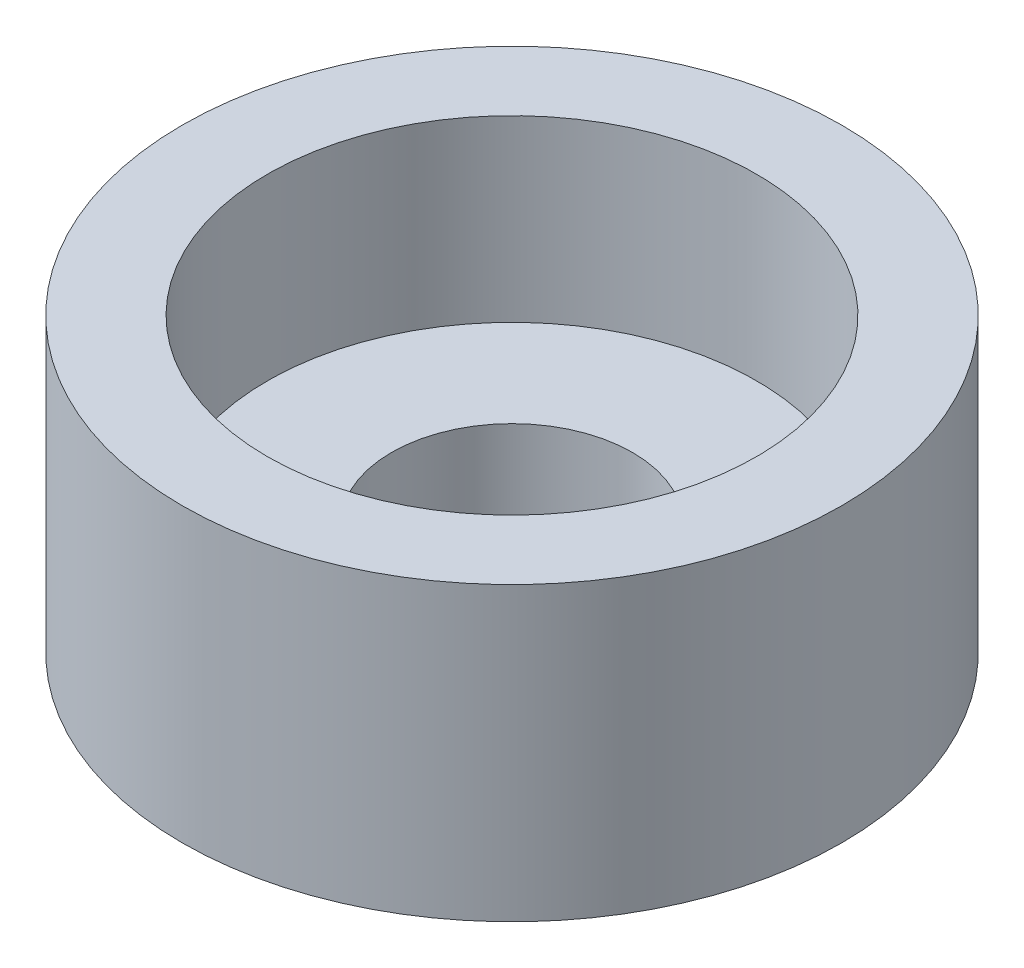
ISO-10303-21;
HEADER;
FILE_DESCRIPTION(('STEP AP214'),'2;1');
FILE_NAME('part.step','',(''),(''),'','','');
FILE_SCHEMA(('AUTOMOTIVE_DESIGN { 1 0 10303 214 1 1 1 1 }'));
ENDSEC;
DATA;
#1=APPLICATION_CONTEXT('core data for automotive mechanical design processes');
#2=APPLICATION_PROTOCOL_DEFINITION('international standard','automotive_design',2000,#1);
#3=PRODUCT_CONTEXT('',#1,'mechanical');
#4=PRODUCT('Part','Part','',(#3));
#5=PRODUCT_RELATED_PRODUCT_CATEGORY('part','',(#4));
#6=PRODUCT_DEFINITION_FORMATION('','',#4);
#7=PRODUCT_DEFINITION_CONTEXT('part definition',#1,'design');
#8=PRODUCT_DEFINITION('design','',#6,#7);
#9=PRODUCT_DEFINITION_SHAPE('','',#8);
#10=(LENGTH_UNIT() NAMED_UNIT(*) SI_UNIT(.MILLI.,.METRE.));
#11=(NAMED_UNIT(*) PLANE_ANGLE_UNIT() SI_UNIT($,.RADIAN.));
#12=(NAMED_UNIT(*) SI_UNIT($,.STERADIAN.) SOLID_ANGLE_UNIT());
#13=UNCERTAINTY_MEASURE_WITH_UNIT(LENGTH_MEASURE(1.E-05),#10,'distance_accuracy_value','');
#14=(GEOMETRIC_REPRESENTATION_CONTEXT(3) GLOBAL_UNCERTAINTY_ASSIGNED_CONTEXT((#13)) GLOBAL_UNIT_ASSIGNED_CONTEXT((#10,
#11,#12)) REPRESENTATION_CONTEXT('',''));
#15=CARTESIAN_POINT('',(0.,0.,0.));
#16=DIRECTION('',(0.,0.,1.));
#17=DIRECTION('',(1.,0.,0.));
#18=AXIS2_PLACEMENT_3D('',#15,#16,#17);
#19=CARTESIAN_POINT('',(0.,31.,0.));
#20=DIRECTION('',(0.,-1.,0.));
#21=DIRECTION('',(0.,0.,-1.));
#22=AXIS2_PLACEMENT_3D('',#19,#20,#21);
#23=CYLINDRICAL_SURFACE('',#22,12.8);
#24=CARTESIAN_POINT('',(0.,0.,0.));
#25=DIRECTION('',(0.,1.,0.));
#26=DIRECTION('',(0.,0.,1.));
#27=AXIS2_PLACEMENT_3D('',#24,#25,#26);
#28=CIRCLE('',#27,12.8);
#29=CARTESIAN_POINT('',(0.,0.,12.8));
#30=VERTEX_POINT('',#29);
#31=EDGE_CURVE('E58',#30,#30,#28,.T.);
#32=ORIENTED_EDGE('',*,*,#31,.F.);
#33=EDGE_LOOP('',(#32));
#34=FACE_BOUND('',#33,.T.);
#35=CARTESIAN_POINT('',(0.,12.,0.));
#36=DIRECTION('',(0.,1.,0.));
#37=DIRECTION('',(0.,0.,1.));
#38=AXIS2_PLACEMENT_3D('',#35,#36,#37);
#39=CIRCLE('',#38,12.8);
#40=CARTESIAN_POINT('',(0.,12.,12.8));
#41=VERTEX_POINT('',#40);
#42=EDGE_CURVE('E47',#41,#41,#39,.T.);
#43=ORIENTED_EDGE('',*,*,#42,.T.);
#44=EDGE_LOOP('',(#43));
#45=FACE_BOUND('',#44,.T.);
#46=ADVANCED_FACE('F43',(#34,#45),#23,.F.);
#47=CARTESIAN_POINT('',(0.,31.,0.));
#48=DIRECTION('',(0.,1.,0.));
#49=DIRECTION('',(0.,0.,1.));
#50=AXIS2_PLACEMENT_3D('',#47,#48,#49);
#51=PLANE('',#50);
#52=CARTESIAN_POINT('',(0.,31.,0.));
#53=DIRECTION('',(0.,1.,0.));
#54=DIRECTION('',(0.,0.,1.));
#55=AXIS2_PLACEMENT_3D('',#52,#53,#54);
#56=CIRCLE('',#55,25.97);
#57=CARTESIAN_POINT('',(0.,31.,25.97));
#58=VERTEX_POINT('',#57);
#59=EDGE_CURVE('E63',#58,#58,#56,.T.);
#60=ORIENTED_EDGE('',*,*,#59,.F.);
#61=EDGE_LOOP('',(#60));
#62=FACE_BOUND('',#61,.T.);
#63=CARTESIAN_POINT('',(0.,31.,0.));
#64=DIRECTION('',(0.,1.,0.));
#65=DIRECTION('',(0.,0.,1.));
#66=AXIS2_PLACEMENT_3D('',#63,#64,#65);
#67=CIRCLE('',#66,35.);
#68=CARTESIAN_POINT('',(0.,31.,35.));
#69=VERTEX_POINT('',#68);
#70=EDGE_CURVE('E10',#69,#69,#67,.T.);
#71=ORIENTED_EDGE('',*,*,#70,.T.);
#72=EDGE_LOOP('',(#71));
#73=FACE_BOUND('',#72,.T.);
#74=ADVANCED_FACE('F108',(#62,#73),#51,.T.);
#75=CARTESIAN_POINT('',(0.,0.,0.));
#76=DIRECTION('',(0.,1.,0.));
#77=DIRECTION('',(0.,0.,1.));
#78=AXIS2_PLACEMENT_3D('',#75,#76,#77);
#79=PLANE('',#78);
#80=CARTESIAN_POINT('',(-25.362762044836,0.,-1.37488234297628));
#81=DIRECTION('',(0.,-1.,0.));
#82=DIRECTION('',(0.,0.,-1.));
#83=AXIS2_PLACEMENT_3D('',#80,#81,#82);
#84=CIRCLE('',#83,2.125);
#85=CARTESIAN_POINT('',(-25.362762044836,0.,-3.49988234297629));
#86=VERTEX_POINT('',#85);
#87=EDGE_CURVE('E88',#86,#86,#84,.T.);
#88=ORIENTED_EDGE('',*,*,#87,.F.);
#89=EDGE_LOOP('',(#88));
#90=FACE_BOUND('',#89,.T.);
#91=CARTESIAN_POINT('',(11.4906979861859,0.,22.6522374124558));
#92=DIRECTION('',(0.,-1.,0.));
#93=DIRECTION('',(0.,0.,-1.));
#94=AXIS2_PLACEMENT_3D('',#91,#92,#93);
#95=CIRCLE('',#94,2.125);
#96=CARTESIAN_POINT('',(11.4906979861859,0.,20.5272374124558));
#97=VERTEX_POINT('',#96);
#98=EDGE_CURVE('E80',#97,#97,#95,.T.);
#99=ORIENTED_EDGE('',*,*,#98,.F.);
#100=EDGE_LOOP('',(#99));
#101=FACE_BOUND('',#100,.T.);
#102=CARTESIAN_POINT('',(13.87206405865,0.,-21.2773550694797));
#103=DIRECTION('',(0.,-1.,0.));
#104=DIRECTION('',(0.,0.,-1.));
#105=AXIS2_PLACEMENT_3D('',#102,#103,#104);
#106=CIRCLE('',#105,2.125);
#107=CARTESIAN_POINT('',(13.87206405865,0.,-23.4023550694797));
#108=VERTEX_POINT('',#107);
#109=EDGE_CURVE('E72',#108,#108,#106,.T.);
#110=ORIENTED_EDGE('',*,*,#109,.F.);
#111=EDGE_LOOP('',(#110));
#112=FACE_BOUND('',#111,.T.);
#113=CARTESIAN_POINT('',(0.,0.,0.));
#114=DIRECTION('',(0.,1.,0.));
#115=DIRECTION('',(0.,0.,1.));
#116=AXIS2_PLACEMENT_3D('',#113,#114,#115);
#117=CIRCLE('',#116,35.);
#118=CARTESIAN_POINT('',(0.,0.,35.));
#119=VERTEX_POINT('',#118);
#120=EDGE_CURVE('E52',#119,#119,#117,.T.);
#121=ORIENTED_EDGE('',*,*,#120,.F.);
#122=EDGE_LOOP('',(#121));
#123=FACE_BOUND('',#122,.T.);
#124=ORIENTED_EDGE('',*,*,#31,.T.);
#125=EDGE_LOOP('',(#124));
#126=FACE_BOUND('',#125,.T.);
#127=ADVANCED_FACE('F105',(#90,#101,#112,#123,#126),#79,.F.);
#128=CARTESIAN_POINT('',(0.,31.,0.));
#129=DIRECTION('',(0.,-1.,0.));
#130=DIRECTION('',(0.,0.,-1.));
#131=AXIS2_PLACEMENT_3D('',#128,#129,#130);
#132=CYLINDRICAL_SURFACE('',#131,35.);
#133=ORIENTED_EDGE('',*,*,#70,.F.);
#134=EDGE_LOOP('',(#133));
#135=FACE_BOUND('',#134,.T.);
#136=ORIENTED_EDGE('',*,*,#120,.T.);
#137=EDGE_LOOP('',(#136));
#138=FACE_BOUND('',#137,.T.);
#139=ADVANCED_FACE('F45',(#135,#138),#132,.T.);
#140=CARTESIAN_POINT('',(0.,12.,0.));
#141=DIRECTION('',(0.,1.,0.));
#142=DIRECTION('',(0.,0.,1.));
#143=AXIS2_PLACEMENT_3D('',#140,#141,#142);
#144=CYLINDRICAL_SURFACE('',#143,25.97);
#145=CARTESIAN_POINT('',(0.,12.,0.));
#146=DIRECTION('',(0.,1.,0.));
#147=DIRECTION('',(0.,0.,1.));
#148=AXIS2_PLACEMENT_3D('',#145,#146,#147);
#149=CIRCLE('',#148,25.97);
#150=CARTESIAN_POINT('',(0.,12.,25.97));
#151=VERTEX_POINT('',#150);
#152=EDGE_CURVE('E67',#151,#151,#149,.T.);
#153=ORIENTED_EDGE('',*,*,#152,.F.);
#154=EDGE_LOOP('',(#153));
#155=FACE_BOUND('',#154,.T.);
#156=ORIENTED_EDGE('',*,*,#59,.T.);
#157=EDGE_LOOP('',(#156));
#158=FACE_BOUND('',#157,.T.);
#159=ADVANCED_FACE('F128',(#155,#158),#144,.F.);
#160=CARTESIAN_POINT('',(0.,12.,0.));
#161=DIRECTION('',(0.,1.,0.));
#162=DIRECTION('',(0.,0.,1.));
#163=AXIS2_PLACEMENT_3D('',#160,#161,#162);
#164=PLANE('',#163);
#165=ORIENTED_EDGE('',*,*,#42,.F.);
#166=EDGE_LOOP('',(#165));
#167=FACE_BOUND('',#166,.T.);
#168=ORIENTED_EDGE('',*,*,#152,.T.);
#169=EDGE_LOOP('',(#168));
#170=FACE_BOUND('',#169,.T.);
#171=ADVANCED_FACE('F124',(#167,#170),#164,.T.);
#172=CARTESIAN_POINT('',(13.87206405865,5.1,-21.2773550694797));
#173=DIRECTION('',(0.,-1.,0.));
#174=DIRECTION('',(0.,0.,-1.));
#175=AXIS2_PLACEMENT_3D('',#172,#173,#174);
#176=CYLINDRICAL_SURFACE('',#175,2.125);
#177=CARTESIAN_POINT('',(13.87206405865,5.1,-21.2773550694797));
#178=DIRECTION('',(0.,-1.,0.));
#179=DIRECTION('',(0.,0.,-1.));
#180=AXIS2_PLACEMENT_3D('',#177,#178,#179);
#181=CIRCLE('',#180,2.125);
#182=CARTESIAN_POINT('',(13.87206405865,5.1,-23.4023550694797));
#183=VERTEX_POINT('',#182);
#184=EDGE_CURVE('E76',#183,#183,#181,.T.);
#185=ORIENTED_EDGE('',*,*,#184,.F.);
#186=EDGE_LOOP('',(#185));
#187=FACE_BOUND('',#186,.T.);
#188=ORIENTED_EDGE('',*,*,#109,.T.);
#189=EDGE_LOOP('',(#188));
#190=FACE_BOUND('',#189,.T.);
#191=ADVANCED_FACE('F127',(#187,#190),#176,.F.);
#192=CARTESIAN_POINT('',(0.,5.1,0.));
#193=DIRECTION('',(0.,-1.,0.));
#194=DIRECTION('',(0.,0.,-1.));
#195=AXIS2_PLACEMENT_3D('',#192,#193,#194);
#196=PLANE('',#195);
#197=ORIENTED_EDGE('',*,*,#184,.T.);
#198=EDGE_LOOP('',(#197));
#199=FACE_BOUND('',#198,.T.);
#200=ADVANCED_FACE('F144',(#199),#196,.T.);
#201=CARTESIAN_POINT('',(11.4906979861859,5.1,22.6522374124558));
#202=DIRECTION('',(0.,-1.,0.));
#203=DIRECTION('',(0.,0.,-1.));
#204=AXIS2_PLACEMENT_3D('',#201,#202,#203);
#205=CYLINDRICAL_SURFACE('',#204,2.125);
#206=CARTESIAN_POINT('',(11.4906979861859,5.1,22.6522374124558));
#207=DIRECTION('',(0.,-1.,0.));
#208=DIRECTION('',(0.,0.,-1.));
#209=AXIS2_PLACEMENT_3D('',#206,#207,#208);
#210=CIRCLE('',#209,2.125);
#211=CARTESIAN_POINT('',(11.4906979861859,5.1,20.5272374124558));
#212=VERTEX_POINT('',#211);
#213=EDGE_CURVE('E84',#212,#212,#210,.T.);
#214=ORIENTED_EDGE('',*,*,#213,.F.);
#215=EDGE_LOOP('',(#214));
#216=FACE_BOUND('',#215,.T.);
#217=ORIENTED_EDGE('',*,*,#98,.T.);
#218=EDGE_LOOP('',(#217));
#219=FACE_BOUND('',#218,.T.);
#220=ADVANCED_FACE('F148',(#216,#219),#205,.F.);
#221=CARTESIAN_POINT('',(0.,5.1,0.));
#222=DIRECTION('',(0.,-1.,0.));
#223=DIRECTION('',(0.,0.,-1.));
#224=AXIS2_PLACEMENT_3D('',#221,#222,#223);
#225=PLANE('',#224);
#226=ORIENTED_EDGE('',*,*,#213,.T.);
#227=EDGE_LOOP('',(#226));
#228=FACE_BOUND('',#227,.T.);
#229=ADVANCED_FACE('F101',(#228),#225,.T.);
#230=CARTESIAN_POINT('',(-25.362762044836,5.1,-1.37488234297628));
#231=DIRECTION('',(0.,-1.,0.));
#232=DIRECTION('',(0.,0.,-1.));
#233=AXIS2_PLACEMENT_3D('',#230,#231,#232);
#234=CYLINDRICAL_SURFACE('',#233,2.125);
#235=CARTESIAN_POINT('',(-25.362762044836,5.1,-1.37488234297628));
#236=DIRECTION('',(0.,-1.,0.));
#237=DIRECTION('',(0.,0.,-1.));
#238=AXIS2_PLACEMENT_3D('',#235,#236,#237);
#239=CIRCLE('',#238,2.125);
#240=CARTESIAN_POINT('',(-25.362762044836,5.1,-3.49988234297629));
#241=VERTEX_POINT('',#240);
#242=EDGE_CURVE('E68',#241,#241,#239,.T.);
#243=ORIENTED_EDGE('',*,*,#242,.F.);
#244=EDGE_LOOP('',(#243));
#245=FACE_BOUND('',#244,.T.);
#246=ORIENTED_EDGE('',*,*,#87,.T.);
#247=EDGE_LOOP('',(#246));
#248=FACE_BOUND('',#247,.T.);
#249=ADVANCED_FACE('F98',(#245,#248),#234,.F.);
#250=CARTESIAN_POINT('',(0.,5.1,0.));
#251=DIRECTION('',(0.,-1.,0.));
#252=DIRECTION('',(0.,0.,-1.));
#253=AXIS2_PLACEMENT_3D('',#250,#251,#252);
#254=PLANE('',#253);
#255=ORIENTED_EDGE('',*,*,#242,.T.);
#256=EDGE_LOOP('',(#255));
#257=FACE_BOUND('',#256,.T.);
#258=ADVANCED_FACE('F96',(#257),#254,.T.);
#259=CLOSED_SHELL('',(#46,#74,#127,#139,#159,#171,#191,#200,#220,#229,#249,#258));
#260=MANIFOLD_SOLID_BREP('B2',#259);
#261=ADVANCED_BREP_SHAPE_REPRESENTATION('',(#18,#260),#14);
#262=SHAPE_DEFINITION_REPRESENTATION(#9,#261);
ENDSEC;
END-ISO-10303-21;
